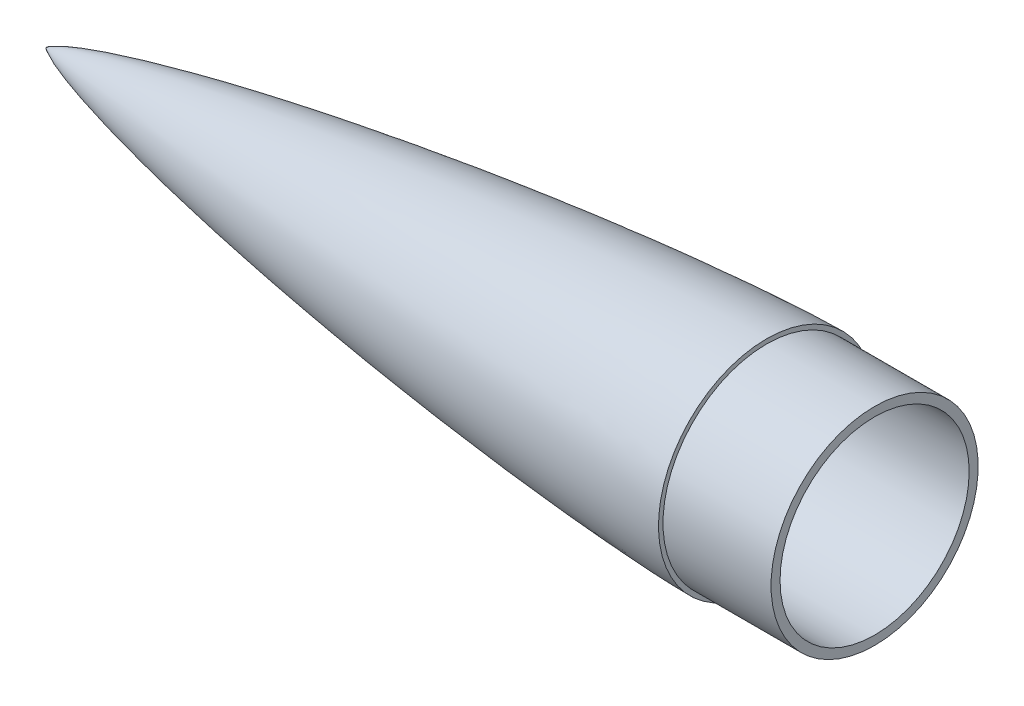
ISO-10303-21;
HEADER;
FILE_DESCRIPTION(('STEP AP214'),'2;1');
FILE_NAME('part.step','',(''),(''),'','','');
FILE_SCHEMA(('AUTOMOTIVE_DESIGN { 1 0 10303 214 1 1 1 1 }'));
ENDSEC;
DATA;
#1=APPLICATION_CONTEXT('core data for automotive mechanical design processes');
#2=APPLICATION_PROTOCOL_DEFINITION('international standard','automotive_design',2000,#1);
#3=PRODUCT_CONTEXT('',#1,'mechanical');
#4=PRODUCT('Part','Part','',(#3));
#5=PRODUCT_RELATED_PRODUCT_CATEGORY('part','',(#4));
#6=PRODUCT_DEFINITION_FORMATION('','',#4);
#7=PRODUCT_DEFINITION_CONTEXT('part definition',#1,'design');
#8=PRODUCT_DEFINITION('design','',#6,#7);
#9=PRODUCT_DEFINITION_SHAPE('','',#8);
#10=(LENGTH_UNIT() NAMED_UNIT(*) SI_UNIT(.MILLI.,.METRE.));
#11=(NAMED_UNIT(*) PLANE_ANGLE_UNIT() SI_UNIT($,.RADIAN.));
#12=(NAMED_UNIT(*) SI_UNIT($,.STERADIAN.) SOLID_ANGLE_UNIT());
#13=UNCERTAINTY_MEASURE_WITH_UNIT(LENGTH_MEASURE(1.E-05),#10,'distance_accuracy_value','');
#14=(GEOMETRIC_REPRESENTATION_CONTEXT(3) GLOBAL_UNCERTAINTY_ASSIGNED_CONTEXT((#13)) GLOBAL_UNIT_ASSIGNED_CONTEXT((#10,
#11,#12)) REPRESENTATION_CONTEXT('',''));
#15=CARTESIAN_POINT('',(0.,0.,0.));
#16=DIRECTION('',(0.,0.,1.));
#17=DIRECTION('',(1.,0.,0.));
#18=AXIS2_PLACEMENT_3D('',#15,#16,#17);
#19=CARTESIAN_POINT('',(6.34999999999996,0.,0.));
#20=CARTESIAN_POINT('',(8.7986768231459,0.907287754664523,0.));
#21=CARTESIAN_POINT('',(13.7273628803764,2.60318197934397,0.));
#22=CARTESIAN_POINT('',(23.7642896731038,5.74609384590777,0.));
#23=CARTESIAN_POINT('',(36.4514199189186,9.31080877452793,0.));
#24=CARTESIAN_POINT('',(51.8064630935316,13.2307683433688,0.));
#25=CARTESIAN_POINT('',(72.3880505304073,18.098925611351,0.));
#26=CARTESIAN_POINT('',(98.2580908766507,23.6608066949454,0.));
#27=CARTESIAN_POINT('',(129.440077612695,29.7395744337296,0.));
#28=CARTESIAN_POINT('',(160.721248611871,35.3397346570324,0.));
#29=CARTESIAN_POINT('',(202.530658258094,42.263190289421,0.));
#30=CARTESIAN_POINT('',(254.945283705691,50.0138259867959,0.));
#31=CARTESIAN_POINT('',(318.021568120155,58.0404368277445,0.));
#32=CARTESIAN_POINT('',(370.706818604387,63.6782126980447,0.));
#33=CARTESIAN_POINT('',(412.915969999808,67.4840676237088,0.));
#34=CARTESIAN_POINT('',(444.601987404056,69.9381804487871,0.));
#35=CARTESIAN_POINT('',(467.833322743067,71.3906741281022,0.));
#36=CARTESIAN_POINT('',(480.503445442415,72.0217952963793,0.));
#37=CARTESIAN_POINT('',(482.600000000004,72.1213736127005,0.));
#38=B_SPLINE_CURVE_WITH_KNOTS('',3,(#19,#20,#21,#22,#23,#24,#25,#26,#27,#28,#29,#30,#31,#32,#33,
#34,#35,#36,#37),.UNSPECIFIED.,.F.,.F.,(4,1,1,1,1,1,1,1,1,1,1,1,1,1,1,1,4),(0.0272717594964814,
0.0423729523571036,0.0574741452177258,0.0876765309389702,0.117878916660215,0.148081302381459,
0.208486073823948,0.268890845266437,0.329295616708925,0.389700388151414,0.510509931036392,
0.631319473921369,0.752129016806347,0.812533788248836,0.872938559691324,0.933343331133813,
0.945322528899407),.UNSPECIFIED.);
#39=CARTESIAN_POINT('',(508.000000000004,0.,0.));
#40=DIRECTION('',(1.,0.,0.));
#41=AXIS1_PLACEMENT('',#39,#40);
#42=SURFACE_OF_REVOLUTION('',#38,#41);
#43=CARTESIAN_POINT('',(482.600000000004,0.,0.));
#44=DIRECTION('',(1.,0.,0.));
#45=DIRECTION('',(0.,1.,0.));
#46=AXIS2_PLACEMENT_3D('',#43,#44,#45);
#47=CIRCLE('',#46,72.1213736127004);
#48=CARTESIAN_POINT('',(482.600000000004,72.1213736127005,0.));
#49=VERTEX_POINT('',#48);
#50=EDGE_CURVE('E11',#49,#49,#47,.T.);
#51=ORIENTED_EDGE('',*,*,#50,.T.);
#52=EDGE_LOOP('',(#51));
#53=FACE_BOUND('',#52,.T.);
#54=CARTESIAN_POINT('',(6.35,0.,0.));
#55=VERTEX_POINT('',#54);
#56=VERTEX_LOOP('',#55);
#57=FACE_BOUND('',#56,.T.);
#58=ADVANCED_FACE('F37',(#53,#57),#42,.F.);
#59=CARTESIAN_POINT('',(482.600000000004,72.1213736127005,0.));
#60=DIRECTION('',(-1.,0.,0.));
#61=DIRECTION('',(0.,-1.,0.));
#62=AXIS2_PLACEMENT_3D('',#59,#60,#61);
#63=PLANE('',#62);
#64=CARTESIAN_POINT('',(482.600000000004,0.,0.));
#65=DIRECTION('',(1.,0.,0.));
#66=DIRECTION('',(0.,1.,0.));
#67=AXIS2_PLACEMENT_3D('',#64,#65,#66);
#68=CIRCLE('',#67,66.675);
#69=CARTESIAN_POINT('',(482.600000000004,66.6750000000001,0.));
#70=VERTEX_POINT('',#69);
#71=EDGE_CURVE('E45',#70,#70,#68,.T.);
#72=ORIENTED_EDGE('',*,*,#71,.T.);
#73=EDGE_LOOP('',(#72));
#74=FACE_BOUND('',#73,.T.);
#75=ORIENTED_EDGE('',*,*,#50,.F.);
#76=EDGE_LOOP('',(#75));
#77=FACE_BOUND('',#76,.T.);
#78=ADVANCED_FACE('F77',(#74,#77),#63,.T.);
#79=CARTESIAN_POINT('',(508.000000000004,0.,0.));
#80=DIRECTION('',(1.,0.,0.));
#81=DIRECTION('',(0.,1.,0.));
#82=AXIS2_PLACEMENT_3D('',#79,#80,#81);
#83=CYLINDRICAL_SURFACE('',#82,66.675);
#84=CARTESIAN_POINT('',(584.200000000004,0.,0.));
#85=DIRECTION('',(1.,0.,0.));
#86=DIRECTION('',(0.,1.,0.));
#87=AXIS2_PLACEMENT_3D('',#84,#85,#86);
#88=CIRCLE('',#87,66.675);
#89=CARTESIAN_POINT('',(584.200000000004,66.6750000000001,0.));
#90=VERTEX_POINT('',#89);
#91=EDGE_CURVE('E72',#90,#90,#88,.T.);
#92=ORIENTED_EDGE('',*,*,#91,.T.);
#93=EDGE_LOOP('',(#92));
#94=FACE_BOUND('',#93,.T.);
#95=ORIENTED_EDGE('',*,*,#71,.F.);
#96=EDGE_LOOP('',(#95));
#97=FACE_BOUND('',#96,.T.);
#98=ADVANCED_FACE('F80',(#94,#97),#83,.F.);
#99=CARTESIAN_POINT('',(584.200000000004,66.6750000000001,0.));
#100=DIRECTION('',(1.,0.,0.));
#101=DIRECTION('',(0.,1.,0.));
#102=AXIS2_PLACEMENT_3D('',#99,#100,#101);
#103=PLANE('',#102);
#104=CARTESIAN_POINT('',(584.200000000004,0.,0.));
#105=DIRECTION('',(1.,0.,0.));
#106=DIRECTION('',(0.,1.,0.));
#107=AXIS2_PLACEMENT_3D('',#104,#105,#106);
#108=CIRCLE('',#107,73.025);
#109=CARTESIAN_POINT('',(584.200000000004,73.0250000000001,0.));
#110=VERTEX_POINT('',#109);
#111=EDGE_CURVE('E63',#110,#110,#108,.T.);
#112=ORIENTED_EDGE('',*,*,#111,.T.);
#113=EDGE_LOOP('',(#112));
#114=FACE_BOUND('',#113,.T.);
#115=ORIENTED_EDGE('',*,*,#91,.F.);
#116=EDGE_LOOP('',(#115));
#117=FACE_BOUND('',#116,.T.);
#118=ADVANCED_FACE('F82',(#114,#117),#103,.T.);
#119=CARTESIAN_POINT('',(508.000000000004,0.,0.));
#120=DIRECTION('',(1.,0.,0.));
#121=DIRECTION('',(0.,1.,0.));
#122=AXIS2_PLACEMENT_3D('',#119,#120,#121);
#123=CYLINDRICAL_SURFACE('',#122,73.025);
#124=CARTESIAN_POINT('',(508.000000000004,0.,0.));
#125=DIRECTION('',(1.,0.,0.));
#126=DIRECTION('',(0.,1.,0.));
#127=AXIS2_PLACEMENT_3D('',#124,#125,#126);
#128=CIRCLE('',#127,73.025);
#129=CARTESIAN_POINT('',(508.000000000004,73.0250000000001,0.));
#130=VERTEX_POINT('',#129);
#131=EDGE_CURVE('E60',#130,#130,#128,.T.);
#132=ORIENTED_EDGE('',*,*,#131,.T.);
#133=EDGE_LOOP('',(#132));
#134=FACE_BOUND('',#133,.T.);
#135=ORIENTED_EDGE('',*,*,#111,.F.);
#136=EDGE_LOOP('',(#135));
#137=FACE_BOUND('',#136,.T.);
#138=ADVANCED_FACE('F89',(#134,#137),#123,.T.);
#139=CARTESIAN_POINT('',(508.000000000004,76.2000000000001,0.));
#140=DIRECTION('',(1.,0.,0.));
#141=DIRECTION('',(0.,1.,0.));
#142=AXIS2_PLACEMENT_3D('',#139,#140,#141);
#143=PLANE('',#142);
#144=CARTESIAN_POINT('',(508.000000000004,0.,0.));
#145=DIRECTION('',(1.,0.,0.));
#146=DIRECTION('',(0.,1.,0.));
#147=AXIS2_PLACEMENT_3D('',#144,#145,#146);
#148=CIRCLE('',#147,76.2);
#149=CARTESIAN_POINT('',(508.000000000004,76.2000000000001,0.));
#150=VERTEX_POINT('',#149);
#151=EDGE_CURVE('E58',#150,#150,#148,.T.);
#152=ORIENTED_EDGE('',*,*,#151,.T.);
#153=EDGE_LOOP('',(#152));
#154=FACE_BOUND('',#153,.T.);
#155=ORIENTED_EDGE('',*,*,#131,.F.);
#156=EDGE_LOOP('',(#155));
#157=FACE_BOUND('',#156,.T.);
#158=ADVANCED_FACE('F54',(#154,#157),#143,.T.);
#159=CARTESIAN_POINT('',(508.000000000004,76.2000000000001,0.));
#160=CARTESIAN_POINT('',(506.471494958106,76.1945675789375,0.));
#161=CARTESIAN_POINT('',(503.41470952701,76.1525940563993,0.));
#162=CARTESIAN_POINT('',(497.302022236754,76.0213442994221,0.));
#163=CARTESIAN_POINT('',(487.168366139117,75.6936594711925,0.));
#164=CARTESIAN_POINT('',(474.544694142474,75.1535223088025,0.));
#165=CARTESIAN_POINT('',(455.415374532976,74.1378062220974,0.));
#166=CARTESIAN_POINT('',(431.317558535705,72.5657219539852,0.));
#167=CARTESIAN_POINT('',(403.22793027783,70.3876611864331,0.));
#168=CARTESIAN_POINT('',(371.159282781257,67.4977613205168,0.));
#169=CARTESIAN_POINT('',(339.125337212704,64.2468490750246,0.));
#170=CARTESIAN_POINT('',(307.127725565525,60.65627316217,0.));
#171=CARTESIAN_POINT('',(275.168941175364,56.7352888267965,0.));
#172=CARTESIAN_POINT('',(243.252504521971,52.4830985830285,0.));
#173=CARTESIAN_POINT('',(211.383441581107,47.8890006088905,0.));
#174=CARTESIAN_POINT('',(179.568799656742,42.931176288562,0.));
#175=CARTESIAN_POINT('',(147.819105397328,37.5721402765015,0.));
#176=CARTESIAN_POINT('',(116.15028801927,31.7518333445773,0.));
#177=CARTESIAN_POINT('',(88.6854364059991,26.1963812513995,0.));
#178=CARTESIAN_POINT('',(65.4133038683169,21.0119273922855,0.));
#179=CARTESIAN_POINT('',(46.1694537841917,16.2796174606769,0.));
#180=CARTESIAN_POINT('',(32.2146344189092,12.5185512560972,0.));
#181=CARTESIAN_POINT('',(20.5953386654288,9.01588677143746,0.));
#182=CARTESIAN_POINT('',(11.981546294603,6.02815511964529,0.));
#183=CARTESIAN_POINT('',(6.81112809414569,3.9503333672817,0.));
#184=CARTESIAN_POINT('',(3.93208488559346,2.61495397409582,0.));
#185=CARTESIAN_POINT('',(2.35336907309941,1.77779001000835,0.));
#186=CARTESIAN_POINT('',(1.45611484367485,1.2392426127877,0.));
#187=CARTESIAN_POINT('',(0.924072548020933,0.880503513688302,0.));
#188=CARTESIAN_POINT('',(0.61026675772319,0.644634607618123,0.));
#189=CARTESIAN_POINT('',(0.407369802378005,0.47572004596397,0.));
#190=CARTESIAN_POINT('',(0.278565166802508,0.357446844062912,0.));
#191=CARTESIAN_POINT('',(0.192516213203047,0.27131690901118,0.));
#192=CARTESIAN_POINT('',(0.121062520529178,0.192173080775056,0.));
#193=CARTESIAN_POINT('',(0.0710138181692952,0.129690141042508,0.));
#194=CARTESIAN_POINT('',(0.0321550981561274,0.0730715289547926,0.));
#195=CARTESIAN_POINT('',(0.0103424502930646,0.0326835627933245,0.));
#196=CARTESIAN_POINT('',(0.00289481880530378,0.0111151545156442,0.));
#197=CARTESIAN_POINT('',(0.,0.,0.));
#198=B_SPLINE_CURVE_WITH_KNOTS('',4,(#159,#160,#161,#162,#163,#164,#165,#166,#167,#168,#169,
#170,#171,#172,#173,#174,#175,#176,#177,#178,#179,#180,#181,#182,#183,#184,#185,#186,#187,#188,
#189,#190,#191,#192,#193,#194,#195,#196,#197),.UNSPECIFIED.,.F.,.F.,(5,1,1,1,1,1,1,1,1,1,1,1,1,
1,1,1,1,1,1,1,1,1,1,1,1,1,1,1,1,1,1,1,1,1,1,5),(0.,0.0118578432680473,0.0237156865360946,
0.0474313730721893,0.0786544605299649,0.109877547987741,0.172323723416681,0.234769900121104,
0.297216073556211,0.359662248910283,0.422108423884707,0.484554599365608,0.547000772902664,
0.609446948301889,0.671893123997519,0.734339297931479,0.796785468432099,0.859231646299098,
0.889261229914499,0.9192908135299,0.950513830207713,0.971341918143476,0.983386684200627,
0.989997136802696,0.993725107542949,0.99595175320143,0.997243318771063,0.998111805935774,
0.998701124711282,0.998995879989268,0.999290635267254,0.99946797645044,0.999645317633627,
0.999822658816814,0.999911329408407,1.),.UNSPECIFIED.);
#199=CARTESIAN_POINT('',(508.000000000004,0.,0.));
#200=DIRECTION('',(1.,0.,0.));
#201=AXIS1_PLACEMENT('',#199,#200);
#202=SURFACE_OF_REVOLUTION('',#198,#201);
#203=CARTESIAN_POINT('',(0.,0.,0.));
#204=VERTEX_POINT('',#203);
#205=VERTEX_LOOP('',#204);
#206=FACE_BOUND('',#205,.T.);
#207=ORIENTED_EDGE('',*,*,#151,.F.);
#208=EDGE_LOOP('',(#207));
#209=FACE_BOUND('',#208,.T.);
#210=ADVANCED_FACE('F51',(#206,#209),#202,.F.);
#211=CLOSED_SHELL('',(#58,#78,#98,#118,#138,#158,#210));
#212=MANIFOLD_SOLID_BREP('B2',#211);
#213=ADVANCED_BREP_SHAPE_REPRESENTATION('',(#18,#212),#14);
#214=SHAPE_DEFINITION_REPRESENTATION(#9,#213);
ENDSEC;
END-ISO-10303-21;
